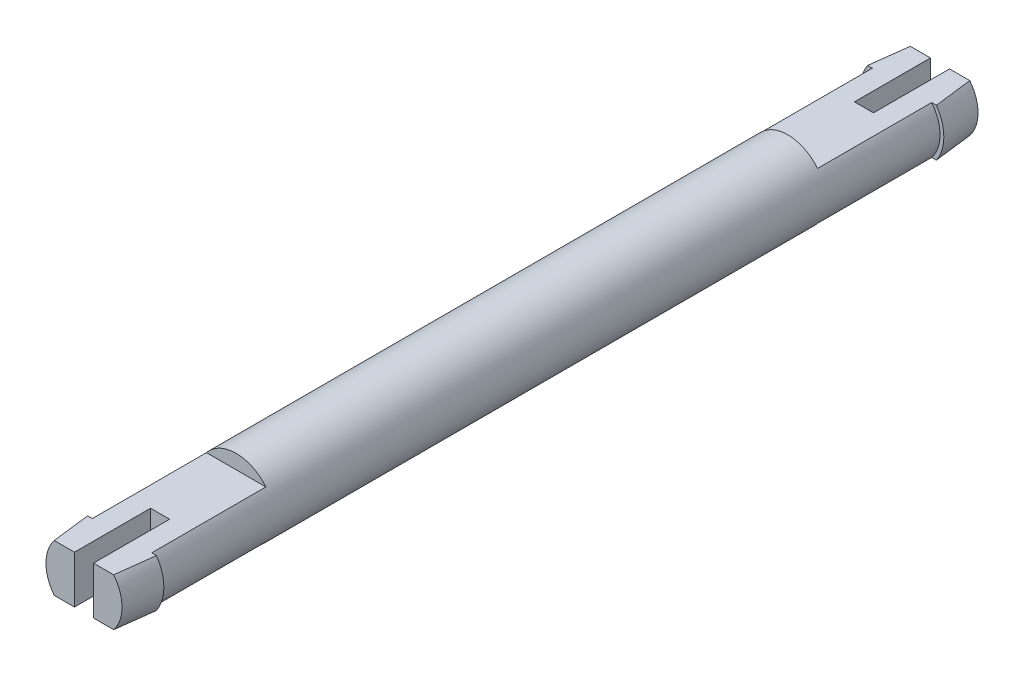
ISO-10303-21;
HEADER;
FILE_DESCRIPTION(('STEP AP214'),'2;1');
FILE_NAME('part.step','',(''),(''),'','','');
FILE_SCHEMA(('AUTOMOTIVE_DESIGN { 1 0 10303 214 1 1 1 1 }'));
ENDSEC;
DATA;
#1=APPLICATION_CONTEXT('core data for automotive mechanical design processes');
#2=APPLICATION_PROTOCOL_DEFINITION('international standard','automotive_design',2000,#1);
#3=PRODUCT_CONTEXT('',#1,'mechanical');
#4=PRODUCT('Part','Part','',(#3));
#5=PRODUCT_RELATED_PRODUCT_CATEGORY('part','',(#4));
#6=PRODUCT_DEFINITION_FORMATION('','',#4);
#7=PRODUCT_DEFINITION_CONTEXT('part definition',#1,'design');
#8=PRODUCT_DEFINITION('design','',#6,#7);
#9=PRODUCT_DEFINITION_SHAPE('','',#8);
#10=(LENGTH_UNIT() NAMED_UNIT(*) SI_UNIT(.MILLI.,.METRE.));
#11=(NAMED_UNIT(*) PLANE_ANGLE_UNIT() SI_UNIT($,.RADIAN.));
#12=(NAMED_UNIT(*) SI_UNIT($,.STERADIAN.) SOLID_ANGLE_UNIT());
#13=UNCERTAINTY_MEASURE_WITH_UNIT(LENGTH_MEASURE(1.E-05),#10,'distance_accuracy_value','');
#14=(GEOMETRIC_REPRESENTATION_CONTEXT(3) GLOBAL_UNCERTAINTY_ASSIGNED_CONTEXT((#13)) GLOBAL_UNIT_ASSIGNED_CONTEXT((#10,
#11,#12)) REPRESENTATION_CONTEXT('',''));
#15=CARTESIAN_POINT('',(0.,0.,0.));
#16=DIRECTION('',(0.,0.,1.));
#17=DIRECTION('',(1.,0.,0.));
#18=AXIS2_PLACEMENT_3D('',#15,#16,#17);
#19=CARTESIAN_POINT('',(0.,0.,-45.));
#20=DIRECTION('',(0.,0.,1.));
#21=DIRECTION('',(1.,0.,0.));
#22=AXIS2_PLACEMENT_3D('',#19,#20,#21);
#23=PLANE('',#22);
#24=DIRECTION('',(-1.,0.,0.));
#25=VECTOR('',#24,1.);
#26=CARTESIAN_POINT('',(0.,-1.25,-45.));
#27=LINE('',#26,#25);
#28=CARTESIAN_POINT('',(1.5612494995996,-1.25,-45.));
#29=VERTEX_POINT('',#28);
#30=CARTESIAN_POINT('',(0.499999999999999,-1.25,-45.));
#31=VERTEX_POINT('',#30);
#32=EDGE_CURVE('E213',#29,#31,#27,.T.);
#33=ORIENTED_EDGE('',*,*,#32,.T.);
#34=DIRECTION('',(0.,1.,0.));
#35=VECTOR('',#34,1.);
#36=CARTESIAN_POINT('',(0.499999999999999,-2.,-45.));
#37=LINE('',#36,#35);
#38=CARTESIAN_POINT('',(0.499999999999999,1.25,-45.));
#39=VERTEX_POINT('',#38);
#40=EDGE_CURVE('E199',#31,#39,#37,.T.);
#41=ORIENTED_EDGE('',*,*,#40,.T.);
#42=DIRECTION('',(1.,0.,0.));
#43=VECTOR('',#42,1.);
#44=CARTESIAN_POINT('',(0.,1.25,-45.));
#45=LINE('',#44,#43);
#46=CARTESIAN_POINT('',(1.5612494995996,1.25,-45.));
#47=VERTEX_POINT('',#46);
#48=EDGE_CURVE('E211',#39,#47,#45,.T.);
#49=ORIENTED_EDGE('',*,*,#48,.T.);
#50=CARTESIAN_POINT('',(0.,0.,-45.));
#51=DIRECTION('',(0.,0.,1.));
#52=DIRECTION('',(1.,0.,0.));
#53=AXIS2_PLACEMENT_3D('',#50,#51,#52);
#54=CIRCLE('',#53,2.);
#55=EDGE_CURVE('E408',#29,#47,#54,.T.);
#56=ORIENTED_EDGE('',*,*,#55,.F.);
#57=EDGE_LOOP('',(#33,#41,#49,#56));
#58=FACE_BOUND('',#57,.T.);
#59=ADVANCED_FACE('F34',(#58),#23,.F.);
#60=CARTESIAN_POINT('',(0.,0.,-43.));
#61=DIRECTION('',(0.,0.,1.));
#62=DIRECTION('',(1.,0.,0.));
#63=AXIS2_PLACEMENT_3D('',#60,#61,#62);
#64=PLANE('',#63);
#65=DIRECTION('',(-1.,0.,0.));
#66=VECTOR('',#65,1.);
#67=CARTESIAN_POINT('',(0.,-1.25,-43.));
#68=LINE('',#67,#66);
#69=CARTESIAN_POINT('',(1.81038669902327,-1.25,-43.0000000000001));
#70=VERTEX_POINT('',#69);
#71=CARTESIAN_POINT('',(1.5612494995996,-1.25,-43.));
#72=VERTEX_POINT('',#71);
#73=EDGE_CURVE('E260',#70,#72,#68,.T.);
#74=ORIENTED_EDGE('',*,*,#73,.F.);
#75=CARTESIAN_POINT('',(0.,0.,-43.));
#76=DIRECTION('',(0.,0.,1.));
#77=DIRECTION('',(1.,0.,0.));
#78=AXIS2_PLACEMENT_3D('',#75,#76,#77);
#79=CIRCLE('',#78,2.2);
#80=CARTESIAN_POINT('',(1.81038669902327,1.25,-43.0000000000001));
#81=VERTEX_POINT('',#80);
#82=EDGE_CURVE('E307',#70,#81,#79,.T.);
#83=ORIENTED_EDGE('',*,*,#82,.T.);
#84=DIRECTION('',(1.,0.,0.));
#85=VECTOR('',#84,1.);
#86=CARTESIAN_POINT('',(0.,1.25,-43.));
#87=LINE('',#86,#85);
#88=CARTESIAN_POINT('',(1.5612494995996,1.25,-43.));
#89=VERTEX_POINT('',#88);
#90=EDGE_CURVE('E291',#89,#81,#87,.T.);
#91=ORIENTED_EDGE('',*,*,#90,.F.);
#92=CARTESIAN_POINT('',(0.,0.,-43.));
#93=DIRECTION('',(0.,0.,1.));
#94=DIRECTION('',(1.,0.,0.));
#95=AXIS2_PLACEMENT_3D('',#92,#93,#94);
#96=CIRCLE('',#95,2.);
#97=EDGE_CURVE('E223',#89,#72,#96,.F.);
#98=ORIENTED_EDGE('',*,*,#97,.T.);
#99=EDGE_LOOP('',(#74,#83,#91,#98));
#100=FACE_BOUND('',#99,.T.);
#101=ADVANCED_FACE('F449',(#100),#64,.T.);
#102=CARTESIAN_POINT('',(0.,0.,-43.));
#103=DIRECTION('',(0.,0.,1.));
#104=DIRECTION('',(1.,0.,0.));
#105=AXIS2_PLACEMENT_3D('',#102,#103,#104);
#106=CONICAL_SURFACE('',#105,2.2,0.0996686524911603);
#107=CARTESIAN_POINT('',(-2.07154781563105,-1.25,-40.8053511030935));
#108=CARTESIAN_POINT('',(-2.03550722726414,-1.25,-41.1139180179247));
#109=CARTESIAN_POINT('',(-1.99922295149763,-1.25,-41.4224563190549));
#110=CARTESIAN_POINT('',(-1.92607039278533,-1.25,-42.0394648246496));
#111=CARTESIAN_POINT('',(-1.88920210764816,-1.25,-42.3479350288541));
#112=CARTESIAN_POINT('',(-1.77758091435319,-1.25,-43.2731887554345));
#113=CARTESIAN_POINT('',(-1.70180760472733,-1.25,-43.889850372761));
#114=CARTESIAN_POINT('',(-1.58512147260778,-1.25,-44.8144760218349));
#115=CARTESIAN_POINT('',(-1.54572075887383,-1.25,-45.1226307817609));
#116=CARTESIAN_POINT('',(-1.46564062998624,-1.25,-45.73877265943));
#117=CARTESIAN_POINT('',(-1.42496122188892,-1.25,-46.0467597780885));
#118=CARTESIAN_POINT('',(-1.34198072748192,-1.25,-46.6625339402322));
#119=CARTESIAN_POINT('',(-1.29967955336675,-1.25,-46.9703209719642));
#120=CARTESIAN_POINT('',(-1.21285635248196,-1.25,-47.5855868834585));
#121=CARTESIAN_POINT('',(-1.16833428338409,-1.25,-47.8930657572336));
#122=CARTESIAN_POINT('',(-1.12240193199714,-1.25,-48.2003390005902));
#123=B_SPLINE_CURVE_WITH_KNOTS('',3,(#107,#108,#109,#110,#111,#112,#113,#114,#115,#116,#117,
#118,#119,#120,#121,#122),.UNSPECIFIED.,.F.,.F.,(4,2,2,2,2,2,2,4),(0.,0.931993165762316,
1.86398982945296,3.7278775087708,4.65986577266912,5.59184889439995,6.52388254692387,
7.45593396996273),.UNSPECIFIED.);
#124=CARTESIAN_POINT('',(-1.81038669902326,-1.25,-43.0000000000001));
#125=VERTEX_POINT('',#124);
#126=CARTESIAN_POINT('',(-1.5612494995996,-1.25,-45.));
#127=VERTEX_POINT('',#126);
#128=EDGE_CURVE('E275',#125,#127,#123,.T.);
#129=ORIENTED_EDGE('',*,*,#128,.F.);
#130=CARTESIAN_POINT('',(-1.81038669902326,1.25,-43.0000000000001));
#131=VERTEX_POINT('',#130);
#132=EDGE_CURVE('E308',#131,#125,#79,.T.);
#133=ORIENTED_EDGE('',*,*,#132,.F.);
#134=CARTESIAN_POINT('',(-1.12240193199714,1.25,-48.2003390005902));
#135=CARTESIAN_POINT('',(-1.16007318188192,1.25,-47.948455021263));
#136=CARTESIAN_POINT('',(-1.19677568222069,1.25,-47.6964288561933));
#137=CARTESIAN_POINT('',(-1.26860770564258,1.25,-47.1921552657799));
#138=CARTESIAN_POINT('',(-1.30373724824443,1.25,-46.9399078432213));
#139=CARTESIAN_POINT('',(-1.37278762127905,1.25,-46.4352571718187));
#140=CARTESIAN_POINT('',(-1.40670849276505,1.25,-46.1828539285641));
#141=CARTESIAN_POINT('',(-1.47357063225507,1.25,-45.6779171395039));
#142=CARTESIAN_POINT('',(-1.50651189747342,1.25,-45.4253835933298));
#143=CARTESIAN_POINT('',(-1.56766910496902,1.25,-44.9506559350624));
#144=CARTESIAN_POINT('',(-1.59597605442951,1.25,-44.7284735200067));
#145=CARTESIAN_POINT('',(-1.66291250795864,1.25,-44.198043320873));
#146=CARTESIAN_POINT('',(-1.70129728585269,1.25,-43.8897646573885));
#147=CARTESIAN_POINT('',(-1.77723656698477,1.25,-43.2731045277543));
#148=CARTESIAN_POINT('',(-1.81479106820383,1.25,-42.9647230613564));
#149=CARTESIAN_POINT('',(-1.88921121609686,1.25,-42.3478817112025));
#150=CARTESIAN_POINT('',(-1.92607687286844,1.25,-42.0394218286632));
#151=CARTESIAN_POINT('',(-1.99922418459548,1.25,-41.4224342581659));
#152=CARTESIAN_POINT('',(-2.03550584228449,1.25,-41.1139065705321));
#153=CARTESIAN_POINT('',(-2.07154781563105,1.25,-40.8053511030935));
#154=B_SPLINE_CURVE_WITH_KNOTS('',3,(#134,#135,#136,#137,#138,#139,#140,#141,#142,#143,#144,
#145,#146,#147,#148,#149,#150,#151,#152,#153),.UNSPECIFIED.,.F.,.F.,(4,2,2,2,2,2,2,2,2,4),(0.,
0.764050536151589,1.52809158862138,2.29210666519177,3.0561239141567,3.72805834866276,
4.66003438385203,5.59201268506309,6.5239773138689,7.45593757911203),.UNSPECIFIED.);
#155=CARTESIAN_POINT('',(-1.5612494995996,1.25,-45.));
#156=VERTEX_POINT('',#155);
#157=EDGE_CURVE('E298',#156,#131,#154,.T.);
#158=ORIENTED_EDGE('',*,*,#157,.F.);
#159=EDGE_CURVE('E409',#156,#127,#54,.T.);
#160=ORIENTED_EDGE('',*,*,#159,.T.);
#161=EDGE_LOOP('',(#129,#133,#158,#160));
#162=FACE_BOUND('',#161,.T.);
#163=ADVANCED_FACE('F455',(#162),#106,.T.);
#164=CARTESIAN_POINT('',(0.,0.,0.));
#165=DIRECTION('',(0.,0.,1.));
#166=DIRECTION('',(1.,0.,0.));
#167=AXIS2_PLACEMENT_3D('',#164,#165,#166);
#168=PLANE('',#167);
#169=DIRECTION('',(0.,-1.,0.));
#170=VECTOR('',#169,1.);
#171=CARTESIAN_POINT('',(-0.5,2.001,0.));
#172=LINE('',#171,#170);
#173=CARTESIAN_POINT('',(-0.5,1.25,0.));
#174=VERTEX_POINT('',#173);
#175=CARTESIAN_POINT('',(-0.5,-1.25,0.));
#176=VERTEX_POINT('',#175);
#177=EDGE_CURVE('E324',#174,#176,#172,.T.);
#178=ORIENTED_EDGE('',*,*,#177,.F.);
#179=DIRECTION('',(1.,0.,0.));
#180=VECTOR('',#179,1.);
#181=CARTESIAN_POINT('',(0.,1.25,0.));
#182=LINE('',#181,#180);
#183=CARTESIAN_POINT('',(-1.5612494995996,1.25,0.));
#184=VERTEX_POINT('',#183);
#185=EDGE_CURVE('E423',#184,#174,#182,.T.);
#186=ORIENTED_EDGE('',*,*,#185,.F.);
#187=CARTESIAN_POINT('',(0.,0.,0.));
#188=DIRECTION('',(0.,0.,1.));
#189=DIRECTION('',(1.,0.,0.));
#190=AXIS2_PLACEMENT_3D('',#187,#188,#189);
#191=CIRCLE('',#190,2.);
#192=CARTESIAN_POINT('',(-1.5612494995996,-1.25,0.));
#193=VERTEX_POINT('',#192);
#194=EDGE_CURVE('E404',#184,#193,#191,.T.);
#195=ORIENTED_EDGE('',*,*,#194,.T.);
#196=DIRECTION('',(-1.,0.,0.));
#197=VECTOR('',#196,1.);
#198=CARTESIAN_POINT('',(0.,-1.25,0.));
#199=LINE('',#198,#197);
#200=EDGE_CURVE('E416',#176,#193,#199,.T.);
#201=ORIENTED_EDGE('',*,*,#200,.F.);
#202=EDGE_LOOP('',(#178,#186,#195,#201));
#203=FACE_BOUND('',#202,.T.);
#204=ADVANCED_FACE('F479',(#203),#168,.T.);
#205=CARTESIAN_POINT('',(0.,0.,0.));
#206=DIRECTION('',(0.,0.,-1.));
#207=DIRECTION('',(-1.,0.,0.));
#208=AXIS2_PLACEMENT_3D('',#205,#206,#207);
#209=CONICAL_SURFACE('',#208,2.,0.0996686524911626);
#210=CARTESIAN_POINT('',(-2.20629085167544,1.25,-5.35787712366069));
#211=CARTESIAN_POINT('',(-2.16911364127436,1.25,-5.03442418142204));
#212=CARTESIAN_POINT('',(-2.13171451989949,1.25,-4.71099685663597));
#213=CARTESIAN_POINT('',(-2.05638780976397,1.25,-4.06420290953939));
#214=CARTESIAN_POINT('',(-2.01846021960565,1.25,-3.74083628739172));
#215=CARTESIAN_POINT('',(-1.90376109024389,1.25,-2.77086975377677));
#216=CARTESIAN_POINT('',(-1.82607027221003,1.25,-2.12437765306017));
#217=CARTESIAN_POINT('',(-1.70685435031514,1.25,-1.15495865945316));
#218=CARTESIAN_POINT('',(-1.6666684414073,1.25,-0.831867113806443));
#219=CARTESIAN_POINT('',(-1.58517894557185,1.25,-0.185825927060364));
#220=CARTESIAN_POINT('',(-1.54387536251855,1.25,0.13712371452695));
#221=CARTESIAN_POINT('',(-1.45986916908057,1.25,0.78285426601202));
#222=CARTESIAN_POINT('',(-1.41716650618307,1.25,1.10563516911335));
#223=CARTESIAN_POINT('',(-1.32989270639121,1.25,1.75094775860942));
#224=CARTESIAN_POINT('',(-1.28532154707355,1.25,2.07347944196602));
#225=CARTESIAN_POINT('',(-1.2395811837065,1.25,2.39584846975232));
#226=B_SPLINE_CURVE_WITH_KNOTS('',3,(#210,#211,#212,#213,#214,#215,#216,#217,#218,#219,#220,
#221,#222,#223,#224,#225),.UNSPECIFIED.,.F.,.F.,(4,2,2,2,2,2,2,4),(0.,0.976747065340103,
1.95349671443936,3.90691894725973,4.88366075798535,5.86039918335276,6.83717431153944,
7.81396116508772),.UNSPECIFIED.);
#227=CARTESIAN_POINT('',(-1.81038669902317,1.25,-2.));
#228=VERTEX_POINT('',#227);
#229=EDGE_CURVE('E340',#228,#184,#226,.T.);
#230=ORIENTED_EDGE('',*,*,#229,.F.);
#231=CARTESIAN_POINT('',(0.,0.,-2.));
#232=DIRECTION('',(0.,0.,1.));
#233=DIRECTION('',(1.,0.,0.));
#234=AXIS2_PLACEMENT_3D('',#231,#232,#233);
#235=CIRCLE('',#234,2.2);
#236=CARTESIAN_POINT('',(-1.81038669902317,-1.25,-2.));
#237=VERTEX_POINT('',#236);
#238=EDGE_CURVE('E400',#228,#237,#235,.T.);
#239=ORIENTED_EDGE('',*,*,#238,.T.);
#240=CARTESIAN_POINT('',(-1.2395811837065,-1.25,2.39584846975232));
#241=CARTESIAN_POINT('',(-1.27708445163935,-1.25,2.13162650097859));
#242=CARTESIAN_POINT('',(-1.31378723609278,-1.25,1.8672925759978));
#243=CARTESIAN_POINT('',(-1.38587498011765,-1.25,1.33844690886302));
#244=CARTESIAN_POINT('',(-1.42125994975575,-1.25,1.07393516808307));
#245=CARTESIAN_POINT('',(-1.49099498681417,-1.25,0.544781873474842));
#246=CARTESIAN_POINT('',(-1.5253450774814,-1.25,0.280140322698457));
#247=CARTESIAN_POINT('',(-1.59319606726225,-1.25,-0.249251984131469));
#248=CARTESIAN_POINT('',(-1.62669696491898,-1.25,-0.514002740371573));
#249=CARTESIAN_POINT('',(-1.68902097967955,-1.25,-1.01186777884924));
#250=CARTESIAN_POINT('',(-1.71792365975446,-1.25,-1.24497212268679));
#251=CARTESIAN_POINT('',(-1.8260728146173,-1.25,-2.1243927650584));
#252=CARTESIAN_POINT('',(-1.90376491575885,-1.25,-2.77090043818358));
#253=CARTESIAN_POINT('',(-2.01846468029957,-1.25,-3.7408748394642));
#254=CARTESIAN_POINT('',(-2.05639139314501,-1.25,-4.06423386196728));
#255=CARTESIAN_POINT('',(-2.13171635303437,-1.25,-4.71101241305846));
#256=CARTESIAN_POINT('',(-2.16911460179215,-1.25,-5.03443194144689));
#257=CARTESIAN_POINT('',(-2.20629085167544,-1.25,-5.35787712366069));
#258=B_SPLINE_CURVE_WITH_KNOTS('',3,(#240,#241,#242,#243,#244,#245,#246,#247,#248,#249,#250,
#251,#252,#253,#254,#255,#256,#257),.UNSPECIFIED.,.F.,.F.,(4,2,2,2,2,2,2,2,4),(0.,
0.800607232202046,1.60120834737588,2.40179146488676,3.20237595579528,3.90704351295181,
5.86051217913121,6.83723890380333,7.81396246011893),.UNSPECIFIED.);
#259=EDGE_CURVE('E392',#193,#237,#258,.T.);
#260=ORIENTED_EDGE('',*,*,#259,.F.);
#261=ORIENTED_EDGE('',*,*,#194,.F.);
#262=EDGE_LOOP('',(#230,#239,#260,#261));
#263=FACE_BOUND('',#262,.T.);
#264=ADVANCED_FACE('F483',(#263),#209,.T.);
#265=CARTESIAN_POINT('',(0.,0.,-2.));
#266=DIRECTION('',(0.,0.,-1.));
#267=DIRECTION('',(-1.,0.,0.));
#268=AXIS2_PLACEMENT_3D('',#265,#266,#267);
#269=PLANE('',#268);
#270=DIRECTION('',(-1.,0.,0.));
#271=VECTOR('',#270,1.);
#272=CARTESIAN_POINT('',(0.,1.25,-2.));
#273=LINE('',#272,#271);
#274=CARTESIAN_POINT('',(1.81038669902317,1.25,-2.));
#275=VERTEX_POINT('',#274);
#276=CARTESIAN_POINT('',(1.5612494995996,1.25,-2.));
#277=VERTEX_POINT('',#276);
#278=EDGE_CURVE('E341',#275,#277,#273,.T.);
#279=ORIENTED_EDGE('',*,*,#278,.F.);
#280=CARTESIAN_POINT('',(1.81038669902317,-1.25,-2.));
#281=VERTEX_POINT('',#280);
#282=EDGE_CURVE('E401',#281,#275,#235,.T.);
#283=ORIENTED_EDGE('',*,*,#282,.F.);
#284=DIRECTION('',(1.,0.,0.));
#285=VECTOR('',#284,1.);
#286=CARTESIAN_POINT('',(0.,-1.25,-2.));
#287=LINE('',#286,#285);
#288=CARTESIAN_POINT('',(1.5612494995996,-1.25,-2.));
#289=VERTEX_POINT('',#288);
#290=EDGE_CURVE('E375',#289,#281,#287,.T.);
#291=ORIENTED_EDGE('',*,*,#290,.F.);
#292=CARTESIAN_POINT('',(0.,0.,-2.));
#293=DIRECTION('',(0.,0.,-1.));
#294=DIRECTION('',(-1.,0.,0.));
#295=AXIS2_PLACEMENT_3D('',#292,#293,#294);
#296=CIRCLE('',#295,2.);
#297=EDGE_CURVE('E413',#289,#277,#296,.F.);
#298=ORIENTED_EDGE('',*,*,#297,.T.);
#299=EDGE_LOOP('',(#279,#283,#291,#298));
#300=FACE_BOUND('',#299,.T.);
#301=ADVANCED_FACE('F488',(#300),#269,.T.);
#302=CARTESIAN_POINT('',(0.,0.,-45.));
#303=DIRECTION('',(0.,0.,1.));
#304=DIRECTION('',(1.,0.,0.));
#305=AXIS2_PLACEMENT_3D('',#302,#303,#304);
#306=CYLINDRICAL_SURFACE('',#305,2.);
#307=DIRECTION('',(0.,0.,1.));
#308=VECTOR('',#307,1.);
#309=CARTESIAN_POINT('',(-1.5612494995996,-1.25,-45.));
#310=LINE('',#309,#308);
#311=CARTESIAN_POINT('',(-1.5612494995996,-1.25,-37.));
#312=VERTEX_POINT('',#311);
#313=CARTESIAN_POINT('',(-1.5612494995996,-1.25,-43.));
#314=VERTEX_POINT('',#313);
#315=EDGE_CURVE('E282',#312,#314,#310,.F.);
#316=ORIENTED_EDGE('',*,*,#315,.F.);
#317=CARTESIAN_POINT('',(0.,0.,-37.));
#318=DIRECTION('',(0.,0.,-1.));
#319=DIRECTION('',(-1.,0.,0.));
#320=AXIS2_PLACEMENT_3D('',#317,#318,#319);
#321=CIRCLE('',#320,2.);
#322=CARTESIAN_POINT('',(1.5612494995996,-1.25,-37.));
#323=VERTEX_POINT('',#322);
#324=EDGE_CURVE('E234',#312,#323,#321,.F.);
#325=ORIENTED_EDGE('',*,*,#324,.T.);
#326=DIRECTION('',(0.,0.,1.));
#327=VECTOR('',#326,1.);
#328=CARTESIAN_POINT('',(1.5612494995996,-1.25,-45.));
#329=LINE('',#328,#327);
#330=EDGE_CURVE('E281',#72,#323,#329,.T.);
#331=ORIENTED_EDGE('',*,*,#330,.F.);
#332=ORIENTED_EDGE('',*,*,#97,.F.);
#333=DIRECTION('',(0.,0.,1.));
#334=VECTOR('',#333,1.);
#335=CARTESIAN_POINT('',(1.5612494995996,1.25,-45.));
#336=LINE('',#335,#334);
#337=CARTESIAN_POINT('',(1.5612494995996,1.25,-37.));
#338=VERTEX_POINT('',#337);
#339=EDGE_CURVE('E304',#338,#89,#336,.F.);
#340=ORIENTED_EDGE('',*,*,#339,.F.);
#341=CARTESIAN_POINT('',(0.,0.,-37.));
#342=DIRECTION('',(0.,0.,1.));
#343=DIRECTION('',(1.,0.,0.));
#344=AXIS2_PLACEMENT_3D('',#341,#342,#343);
#345=CIRCLE('',#344,2.);
#346=CARTESIAN_POINT('',(-1.5612494995996,1.25,-37.));
#347=VERTEX_POINT('',#346);
#348=EDGE_CURVE('E226',#347,#338,#345,.F.);
#349=ORIENTED_EDGE('',*,*,#348,.F.);
#350=DIRECTION('',(0.,0.,1.));
#351=VECTOR('',#350,1.);
#352=CARTESIAN_POINT('',(-1.5612494995996,1.25,-45.));
#353=LINE('',#352,#351);
#354=CARTESIAN_POINT('',(-1.5612494995996,1.25,-43.));
#355=VERTEX_POINT('',#354);
#356=EDGE_CURVE('E305',#355,#347,#353,.T.);
#357=ORIENTED_EDGE('',*,*,#356,.F.);
#358=EDGE_CURVE('E228',#314,#355,#96,.F.);
#359=ORIENTED_EDGE('',*,*,#358,.F.);
#360=EDGE_LOOP('',(#316,#325,#331,#332,#340,#349,#357,#359));
#361=FACE_BOUND('',#360,.T.);
#362=DIRECTION('',(0.,0.,1.));
#363=VECTOR('',#362,1.);
#364=CARTESIAN_POINT('',(1.5612494995996,1.25,-45.));
#365=LINE('',#364,#363);
#366=CARTESIAN_POINT('',(1.5612494995996,1.25,-8.));
#367=VERTEX_POINT('',#366);
#368=EDGE_CURVE('E370',#277,#367,#365,.F.);
#369=ORIENTED_EDGE('',*,*,#368,.F.);
#370=ORIENTED_EDGE('',*,*,#297,.F.);
#371=DIRECTION('',(0.,0.,1.));
#372=VECTOR('',#371,1.);
#373=CARTESIAN_POINT('',(1.5612494995996,-1.25,-45.));
#374=LINE('',#373,#372);
#375=CARTESIAN_POINT('',(1.5612494995996,-1.25,-8.));
#376=VERTEX_POINT('',#375);
#377=EDGE_CURVE('E383',#376,#289,#374,.T.);
#378=ORIENTED_EDGE('',*,*,#377,.F.);
#379=CARTESIAN_POINT('',(0.,0.,-8.));
#380=DIRECTION('',(0.,0.,-1.));
#381=DIRECTION('',(-1.,0.,0.));
#382=AXIS2_PLACEMENT_3D('',#379,#380,#381);
#383=CIRCLE('',#382,2.);
#384=CARTESIAN_POINT('',(-1.5612494995996,-1.25,-8.));
#385=VERTEX_POINT('',#384);
#386=EDGE_CURVE('E420',#385,#376,#383,.F.);
#387=ORIENTED_EDGE('',*,*,#386,.F.);
#388=DIRECTION('',(0.,0.,1.));
#389=VECTOR('',#388,1.);
#390=CARTESIAN_POINT('',(-1.5612494995996,-1.25,-45.));
#391=LINE('',#390,#389);
#392=CARTESIAN_POINT('',(-1.5612494995996,-1.25,-2.));
#393=VERTEX_POINT('',#392);
#394=EDGE_CURVE('E398',#393,#385,#391,.F.);
#395=ORIENTED_EDGE('',*,*,#394,.F.);
#396=CARTESIAN_POINT('',(-1.5612494995996,1.25,-2.));
#397=VERTEX_POINT('',#396);
#398=EDGE_CURVE('E412',#397,#393,#296,.F.);
#399=ORIENTED_EDGE('',*,*,#398,.F.);
#400=DIRECTION('',(0.,0.,1.));
#401=VECTOR('',#400,1.);
#402=CARTESIAN_POINT('',(-1.5612494995996,1.25,-45.));
#403=LINE('',#402,#401);
#404=CARTESIAN_POINT('',(-1.5612494995996,1.25,-8.));
#405=VERTEX_POINT('',#404);
#406=EDGE_CURVE('E348',#405,#397,#403,.T.);
#407=ORIENTED_EDGE('',*,*,#406,.F.);
#408=CARTESIAN_POINT('',(0.,0.,-8.));
#409=DIRECTION('',(0.,0.,-1.));
#410=DIRECTION('',(-1.,0.,0.));
#411=AXIS2_PLACEMENT_3D('',#408,#409,#410);
#412=CIRCLE('',#411,2.);
#413=EDGE_CURVE('E425',#367,#405,#412,.F.);
#414=ORIENTED_EDGE('',*,*,#413,.F.);
#415=EDGE_LOOP('',(#369,#370,#378,#387,#395,#399,#407,#414));
#416=FACE_BOUND('',#415,.T.);
#417=ADVANCED_FACE('F36',(#361,#416),#306,.T.);
#418=CARTESIAN_POINT('',(1.2395811837065,1.25,2.39584846975232));
#419=CARTESIAN_POINT('',(1.27708445163935,1.25,2.13162650097859));
#420=CARTESIAN_POINT('',(1.31378723609278,1.25,1.8672925759978));
#421=CARTESIAN_POINT('',(1.38587498011765,1.25,1.33844690886302));
#422=CARTESIAN_POINT('',(1.42125994975575,1.25,1.07393516808307));
#423=CARTESIAN_POINT('',(1.49099498681417,1.25,0.544781873474842));
#424=CARTESIAN_POINT('',(1.5253450774814,1.25,0.280140322698457));
#425=CARTESIAN_POINT('',(1.59319606726225,1.25,-0.249251984131469));
#426=CARTESIAN_POINT('',(1.62669696491898,1.25,-0.514002740371573));
#427=CARTESIAN_POINT('',(1.68902097967955,1.25,-1.01186777884924));
#428=CARTESIAN_POINT('',(1.71792365975446,1.25,-1.24497212268679));
#429=CARTESIAN_POINT('',(1.8260728146173,1.25,-2.1243927650584));
#430=CARTESIAN_POINT('',(1.90376491575885,1.25,-2.77090043818358));
#431=CARTESIAN_POINT('',(2.01846468029957,1.25,-3.7408748394642));
#432=CARTESIAN_POINT('',(2.05639139314501,1.25,-4.06423386196728));
#433=CARTESIAN_POINT('',(2.13171635303437,1.25,-4.71101241305846));
#434=CARTESIAN_POINT('',(2.16911460179215,1.25,-5.03443194144689));
#435=CARTESIAN_POINT('',(2.20629085167544,1.25,-5.35787712366069));
#436=B_SPLINE_CURVE_WITH_KNOTS('',3,(#418,#419,#420,#421,#422,#423,#424,#425,#426,#427,#428,
#429,#430,#431,#432,#433,#434,#435),.UNSPECIFIED.,.F.,.F.,(4,2,2,2,2,2,2,2,4),(0.,
0.800607232202046,1.60120834737588,2.40179146488676,3.20237595579528,3.90704351295181,
5.86051217913121,6.83723890380333,7.81396246011893),.UNSPECIFIED.);
#437=CARTESIAN_POINT('',(1.5612494995996,1.25,0.));
#438=VERTEX_POINT('',#437);
#439=EDGE_CURVE('E365',#438,#275,#436,.T.);
#440=ORIENTED_EDGE('',*,*,#439,.F.);
#441=CARTESIAN_POINT('',(1.5612494995996,-1.25,0.));
#442=VERTEX_POINT('',#441);
#443=EDGE_CURVE('E405',#442,#438,#191,.T.);
#444=ORIENTED_EDGE('',*,*,#443,.F.);
#445=CARTESIAN_POINT('',(2.20629085167544,-1.25,-5.35787712366069));
#446=CARTESIAN_POINT('',(2.16911364127436,-1.25,-5.03442418142204));
#447=CARTESIAN_POINT('',(2.13171451989949,-1.25,-4.71099685663597));
#448=CARTESIAN_POINT('',(2.05638780976397,-1.25,-4.06420290953939));
#449=CARTESIAN_POINT('',(2.01846021960565,-1.25,-3.74083628739172));
#450=CARTESIAN_POINT('',(1.90376109024389,-1.25,-2.77086975377677));
#451=CARTESIAN_POINT('',(1.82607027221003,-1.25,-2.12437765306017));
#452=CARTESIAN_POINT('',(1.70685435031514,-1.25,-1.15495865945316));
#453=CARTESIAN_POINT('',(1.6666684414073,-1.25,-0.831867113806443));
#454=CARTESIAN_POINT('',(1.58517894557185,-1.25,-0.185825927060364));
#455=CARTESIAN_POINT('',(1.54387536251855,-1.25,0.13712371452695));
#456=CARTESIAN_POINT('',(1.45986916908057,-1.25,0.78285426601202));
#457=CARTESIAN_POINT('',(1.41716650618307,-1.25,1.10563516911335));
#458=CARTESIAN_POINT('',(1.32989270639121,-1.25,1.75094775860942));
#459=CARTESIAN_POINT('',(1.28532154707355,-1.25,2.07347944196602));
#460=CARTESIAN_POINT('',(1.2395811837065,-1.25,2.39584846975232));
#461=B_SPLINE_CURVE_WITH_KNOTS('',3,(#445,#446,#447,#448,#449,#450,#451,#452,#453,#454,#455,
#456,#457,#458,#459,#460),.UNSPECIFIED.,.F.,.F.,(4,2,2,2,2,2,2,4),(0.,0.976747065340103,
1.95349671443936,3.90691894725973,4.88366075798535,5.86039918335276,6.83717431153944,
7.81396116508772),.UNSPECIFIED.);
#462=EDGE_CURVE('E377',#281,#442,#461,.T.);
#463=ORIENTED_EDGE('',*,*,#462,.F.);
#464=ORIENTED_EDGE('',*,*,#282,.T.);
#465=EDGE_LOOP('',(#440,#444,#463,#464));
#466=FACE_BOUND('',#465,.T.);
#467=ADVANCED_FACE('F350',(#466),#209,.T.);
#468=EDGE_CURVE('E338',#397,#228,#273,.T.);
#469=ORIENTED_EDGE('',*,*,#468,.F.);
#470=ORIENTED_EDGE('',*,*,#398,.T.);
#471=EDGE_CURVE('E378',#237,#393,#287,.T.);
#472=ORIENTED_EDGE('',*,*,#471,.F.);
#473=ORIENTED_EDGE('',*,*,#238,.F.);
#474=EDGE_LOOP('',(#469,#470,#472,#473));
#475=FACE_BOUND('',#474,.T.);
#476=ADVANCED_FACE('F390',(#475),#269,.T.);
#477=DIRECTION('',(0.,-1.,0.));
#478=VECTOR('',#477,1.);
#479=CARTESIAN_POINT('',(0.5,2.001,0.));
#480=LINE('',#479,#478);
#481=CARTESIAN_POINT('',(0.5,1.25,0.));
#482=VERTEX_POINT('',#481);
#483=CARTESIAN_POINT('',(0.5,-1.25,0.));
#484=VERTEX_POINT('',#483);
#485=EDGE_CURVE('E327',#482,#484,#480,.T.);
#486=ORIENTED_EDGE('',*,*,#485,.T.);
#487=EDGE_CURVE('E417',#442,#484,#199,.T.);
#488=ORIENTED_EDGE('',*,*,#487,.F.);
#489=ORIENTED_EDGE('',*,*,#443,.T.);
#490=EDGE_CURVE('E422',#482,#438,#182,.T.);
#491=ORIENTED_EDGE('',*,*,#490,.F.);
#492=EDGE_LOOP('',(#486,#488,#489,#491));
#493=FACE_BOUND('',#492,.T.);
#494=ADVANCED_FACE('F388',(#493),#168,.T.);
#495=CARTESIAN_POINT('',(-2.1,-1.25,-8.));
#496=DIRECTION('',(0.,1.,0.));
#497=DIRECTION('',(0.,0.,1.));
#498=AXIS2_PLACEMENT_3D('',#495,#496,#497);
#499=PLANE('',#498);
#500=DIRECTION('',(1.,0.,0.));
#501=VECTOR('',#500,1.);
#502=CARTESIAN_POINT('',(-0.5,-1.25,-4.));
#503=LINE('',#502,#501);
#504=CARTESIAN_POINT('',(-0.5,-1.25,-4.));
#505=VERTEX_POINT('',#504);
#506=CARTESIAN_POINT('',(0.5,-1.25,-4.));
#507=VERTEX_POINT('',#506);
#508=EDGE_CURVE('E318',#505,#507,#503,.T.);
#509=ORIENTED_EDGE('',*,*,#508,.F.);
#510=DIRECTION('',(0.,0.,-1.));
#511=VECTOR('',#510,1.);
#512=CARTESIAN_POINT('',(-0.5,-1.25,0.));
#513=LINE('',#512,#511);
#514=EDGE_CURVE('E315',#176,#505,#513,.T.);
#515=ORIENTED_EDGE('',*,*,#514,.F.);
#516=ORIENTED_EDGE('',*,*,#200,.T.);
#517=ORIENTED_EDGE('',*,*,#259,.T.);
#518=ORIENTED_EDGE('',*,*,#471,.T.);
#519=ORIENTED_EDGE('',*,*,#394,.T.);
#520=DIRECTION('',(-1.,0.,0.));
#521=VECTOR('',#520,1.);
#522=CARTESIAN_POINT('',(-2.1,-1.25,-8.));
#523=LINE('',#522,#521);
#524=EDGE_CURVE('E372',#376,#385,#523,.T.);
#525=ORIENTED_EDGE('',*,*,#524,.F.);
#526=ORIENTED_EDGE('',*,*,#377,.T.);
#527=ORIENTED_EDGE('',*,*,#290,.T.);
#528=ORIENTED_EDGE('',*,*,#462,.T.);
#529=ORIENTED_EDGE('',*,*,#487,.T.);
#530=DIRECTION('',(0.,0.,1.));
#531=VECTOR('',#530,1.);
#532=CARTESIAN_POINT('',(0.5,-1.25,0.));
#533=LINE('',#532,#531);
#534=EDGE_CURVE('E321',#507,#484,#533,.T.);
#535=ORIENTED_EDGE('',*,*,#534,.F.);
#536=EDGE_LOOP('',(#509,#515,#516,#517,#518,#519,#525,#526,#527,#528,#529,#535));
#537=FACE_BOUND('',#536,.T.);
#538=ADVANCED_FACE('F385',(#537),#499,.F.);
#539=CARTESIAN_POINT('',(-2.1,-1.25,-8.));
#540=DIRECTION('',(0.,0.,-1.));
#541=DIRECTION('',(-1.,0.,0.));
#542=AXIS2_PLACEMENT_3D('',#539,#540,#541);
#543=PLANE('',#542);
#544=ORIENTED_EDGE('',*,*,#386,.T.);
#545=ORIENTED_EDGE('',*,*,#524,.T.);
#546=EDGE_LOOP('',(#544,#545));
#547=FACE_BOUND('',#546,.T.);
#548=ADVANCED_FACE('F360',(#547),#543,.F.);
#549=CARTESIAN_POINT('',(-2.1,1.25,-8.));
#550=DIRECTION('',(0.,-1.,0.));
#551=DIRECTION('',(0.,0.,-1.));
#552=AXIS2_PLACEMENT_3D('',#549,#550,#551);
#553=PLANE('',#552);
#554=ORIENTED_EDGE('',*,*,#185,.T.);
#555=DIRECTION('',(0.,0.,1.));
#556=VECTOR('',#555,1.);
#557=CARTESIAN_POINT('',(-0.5,1.25,0.));
#558=LINE('',#557,#556);
#559=CARTESIAN_POINT('',(-0.5,1.25,-4.));
#560=VERTEX_POINT('',#559);
#561=EDGE_CURVE('E313',#560,#174,#558,.T.);
#562=ORIENTED_EDGE('',*,*,#561,.F.);
#563=DIRECTION('',(-1.,0.,0.));
#564=VECTOR('',#563,1.);
#565=CARTESIAN_POINT('',(-0.5,1.25,-4.));
#566=LINE('',#565,#564);
#567=CARTESIAN_POINT('',(0.5,1.25,-4.));
#568=VERTEX_POINT('',#567);
#569=EDGE_CURVE('E326',#568,#560,#566,.T.);
#570=ORIENTED_EDGE('',*,*,#569,.F.);
#571=DIRECTION('',(0.,0.,-1.));
#572=VECTOR('',#571,1.);
#573=CARTESIAN_POINT('',(0.5,1.25,0.));
#574=LINE('',#573,#572);
#575=EDGE_CURVE('E311',#482,#568,#574,.T.);
#576=ORIENTED_EDGE('',*,*,#575,.F.);
#577=ORIENTED_EDGE('',*,*,#490,.T.);
#578=ORIENTED_EDGE('',*,*,#439,.T.);
#579=ORIENTED_EDGE('',*,*,#278,.T.);
#580=ORIENTED_EDGE('',*,*,#368,.T.);
#581=DIRECTION('',(1.,0.,0.));
#582=VECTOR('',#581,1.);
#583=CARTESIAN_POINT('',(-2.1,1.25,-8.));
#584=LINE('',#583,#582);
#585=EDGE_CURVE('E335',#405,#367,#584,.T.);
#586=ORIENTED_EDGE('',*,*,#585,.F.);
#587=ORIENTED_EDGE('',*,*,#406,.T.);
#588=ORIENTED_EDGE('',*,*,#468,.T.);
#589=ORIENTED_EDGE('',*,*,#229,.T.);
#590=EDGE_LOOP('',(#554,#562,#570,#576,#577,#578,#579,#580,#586,#587,#588,#589));
#591=FACE_BOUND('',#590,.T.);
#592=ADVANCED_FACE('F354',(#591),#553,.F.);
#593=CARTESIAN_POINT('',(2.1,2.25,-8.));
#594=DIRECTION('',(0.,0.,-1.));
#595=DIRECTION('',(-1.,0.,0.));
#596=AXIS2_PLACEMENT_3D('',#593,#594,#595);
#597=PLANE('',#596);
#598=ORIENTED_EDGE('',*,*,#413,.T.);
#599=ORIENTED_EDGE('',*,*,#585,.T.);
#600=EDGE_LOOP('',(#598,#599));
#601=FACE_BOUND('',#600,.T.);
#602=ADVANCED_FACE('F359',(#601),#597,.F.);
#603=CARTESIAN_POINT('',(-0.5,2.001,0.));
#604=DIRECTION('',(-1.,0.,0.));
#605=DIRECTION('',(0.,0.,1.));
#606=AXIS2_PLACEMENT_3D('',#603,#604,#605);
#607=PLANE('',#606);
#608=ORIENTED_EDGE('',*,*,#561,.T.);
#609=ORIENTED_EDGE('',*,*,#177,.T.);
#610=ORIENTED_EDGE('',*,*,#514,.T.);
#611=DIRECTION('',(0.,-1.,0.));
#612=VECTOR('',#611,1.);
#613=CARTESIAN_POINT('',(-0.5,2.001,-4.));
#614=LINE('',#613,#612);
#615=EDGE_CURVE('E323',#560,#505,#614,.T.);
#616=ORIENTED_EDGE('',*,*,#615,.F.);
#617=EDGE_LOOP('',(#608,#609,#610,#616));
#618=FACE_BOUND('',#617,.T.);
#619=ADVANCED_FACE('F542',(#618),#607,.F.);
#620=CARTESIAN_POINT('',(0.5,2.001,0.));
#621=DIRECTION('',(1.,0.,0.));
#622=DIRECTION('',(0.,0.,-1.));
#623=AXIS2_PLACEMENT_3D('',#620,#621,#622);
#624=PLANE('',#623);
#625=ORIENTED_EDGE('',*,*,#575,.T.);
#626=DIRECTION('',(0.,-1.,0.));
#627=VECTOR('',#626,1.);
#628=CARTESIAN_POINT('',(0.5,2.001,-4.));
#629=LINE('',#628,#627);
#630=EDGE_CURVE('E330',#568,#507,#629,.T.);
#631=ORIENTED_EDGE('',*,*,#630,.T.);
#632=ORIENTED_EDGE('',*,*,#534,.T.);
#633=ORIENTED_EDGE('',*,*,#485,.F.);
#634=EDGE_LOOP('',(#625,#631,#632,#633));
#635=FACE_BOUND('',#634,.T.);
#636=ADVANCED_FACE('F547',(#635),#624,.F.);
#637=CARTESIAN_POINT('',(-0.5,2.001,-4.));
#638=DIRECTION('',(0.,0.,-1.));
#639=DIRECTION('',(-1.,0.,0.));
#640=AXIS2_PLACEMENT_3D('',#637,#638,#639);
#641=PLANE('',#640);
#642=ORIENTED_EDGE('',*,*,#569,.T.);
#643=ORIENTED_EDGE('',*,*,#615,.T.);
#644=ORIENTED_EDGE('',*,*,#508,.T.);
#645=ORIENTED_EDGE('',*,*,#630,.F.);
#646=EDGE_LOOP('',(#642,#643,#644,#645));
#647=FACE_BOUND('',#646,.T.);
#648=ADVANCED_FACE('F476',(#647),#641,.F.);
#649=EDGE_CURVE('E280',#314,#125,#68,.T.);
#650=ORIENTED_EDGE('',*,*,#649,.F.);
#651=ORIENTED_EDGE('',*,*,#358,.T.);
#652=EDGE_CURVE('E303',#131,#355,#87,.T.);
#653=ORIENTED_EDGE('',*,*,#652,.F.);
#654=ORIENTED_EDGE('',*,*,#132,.T.);
#655=EDGE_LOOP('',(#650,#651,#653,#654));
#656=FACE_BOUND('',#655,.T.);
#657=ADVANCED_FACE('F434',(#656),#64,.T.);
#658=CARTESIAN_POINT('',(1.12240193199715,-1.25,-48.2003390005902));
#659=CARTESIAN_POINT('',(1.16007318188192,-1.25,-47.9484550212629));
#660=CARTESIAN_POINT('',(1.19677568222069,-1.25,-47.6964288561933));
#661=CARTESIAN_POINT('',(1.26860770564258,-1.25,-47.1921552657798));
#662=CARTESIAN_POINT('',(1.30373724824444,-1.25,-46.9399078432212));
#663=CARTESIAN_POINT('',(1.37278762127905,-1.25,-46.4352571718187));
#664=CARTESIAN_POINT('',(1.40670849276505,-1.25,-46.1828539285641));
#665=CARTESIAN_POINT('',(1.47357063225507,-1.25,-45.6779171395039));
#666=CARTESIAN_POINT('',(1.50651189747343,-1.25,-45.4253835933298));
#667=CARTESIAN_POINT('',(1.56766910496902,-1.25,-44.9506559350624));
#668=CARTESIAN_POINT('',(1.59597605442952,-1.25,-44.7284735200067));
#669=CARTESIAN_POINT('',(1.66291250795864,-1.25,-44.198043320873));
#670=CARTESIAN_POINT('',(1.70129728585269,-1.25,-43.8897646573885));
#671=CARTESIAN_POINT('',(1.77723656698478,-1.25,-43.2731045277542));
#672=CARTESIAN_POINT('',(1.81479106820384,-1.25,-42.9647230613564));
#673=CARTESIAN_POINT('',(1.88921121609686,-1.25,-42.3478817112025));
#674=CARTESIAN_POINT('',(1.92607687286844,-1.25,-42.0394218286632));
#675=CARTESIAN_POINT('',(1.99922418459548,-1.25,-41.4224342581659));
#676=CARTESIAN_POINT('',(2.0355058422845,-1.25,-41.1139065705321));
#677=CARTESIAN_POINT('',(2.07154781563105,-1.25,-40.8053511030935));
#678=B_SPLINE_CURVE_WITH_KNOTS('',3,(#658,#659,#660,#661,#662,#663,#664,#665,#666,#667,#668,
#669,#670,#671,#672,#673,#674,#675,#676,#677),.UNSPECIFIED.,.F.,.F.,(4,2,2,2,2,2,2,2,2,4),(0.,
0.764050536151596,1.52809158862139,2.29210666519175,3.0561239141567,3.72805834866276,
4.66003438385204,5.59201268506311,6.52397731386891,7.45593757911203),.UNSPECIFIED.);
#679=EDGE_CURVE('E247',#29,#70,#678,.T.);
#680=ORIENTED_EDGE('',*,*,#679,.F.);
#681=ORIENTED_EDGE('',*,*,#55,.T.);
#682=CARTESIAN_POINT('',(2.07154781563105,1.25,-40.8053511030935));
#683=CARTESIAN_POINT('',(2.03550722726414,1.25,-41.1139180179247));
#684=CARTESIAN_POINT('',(1.99922295149764,1.25,-41.4224563190549));
#685=CARTESIAN_POINT('',(1.92607039278533,1.25,-42.0394648246496));
#686=CARTESIAN_POINT('',(1.88920210764817,1.25,-42.3479350288541));
#687=CARTESIAN_POINT('',(1.77758091435319,1.25,-43.2731887554345));
#688=CARTESIAN_POINT('',(1.70180760472733,1.25,-43.889850372761));
#689=CARTESIAN_POINT('',(1.58512147260778,1.25,-44.8144760218349));
#690=CARTESIAN_POINT('',(1.54572075887383,1.25,-45.1226307817609));
#691=CARTESIAN_POINT('',(1.46564062998624,1.25,-45.73877265943));
#692=CARTESIAN_POINT('',(1.42496122188892,1.25,-46.0467597780885));
#693=CARTESIAN_POINT('',(1.34198072748192,1.25,-46.6625339402322));
#694=CARTESIAN_POINT('',(1.29967955336675,1.25,-46.9703209719642));
#695=CARTESIAN_POINT('',(1.21285635248196,1.25,-47.5855868834585));
#696=CARTESIAN_POINT('',(1.16833428338409,1.25,-47.8930657572336));
#697=CARTESIAN_POINT('',(1.12240193199715,1.25,-48.2003390005902));
#698=B_SPLINE_CURVE_WITH_KNOTS('',3,(#682,#683,#684,#685,#686,#687,#688,#689,#690,#691,#692,
#693,#694,#695,#696,#697),.UNSPECIFIED.,.F.,.F.,(4,2,2,2,2,2,2,4),(0.,0.931993165762316,
1.86398982945296,3.7278775087708,4.65986577266912,5.59184889439995,6.52388254692387,
7.45593396996273),.UNSPECIFIED.);
#699=EDGE_CURVE('E221',#81,#47,#698,.T.);
#700=ORIENTED_EDGE('',*,*,#699,.F.);
#701=ORIENTED_EDGE('',*,*,#82,.F.);
#702=EDGE_LOOP('',(#680,#681,#700,#701));
#703=FACE_BOUND('',#702,.T.);
#704=ADVANCED_FACE('F262',(#703),#106,.T.);
#705=CARTESIAN_POINT('',(-0.500000000000002,1.25,-45.));
#706=VERTEX_POINT('',#705);
#707=EDGE_CURVE('E222',#156,#706,#45,.T.);
#708=ORIENTED_EDGE('',*,*,#707,.T.);
#709=DIRECTION('',(0.,1.,0.));
#710=VECTOR('',#709,1.);
#711=CARTESIAN_POINT('',(-0.500000000000002,-2.,-45.));
#712=LINE('',#711,#710);
#713=CARTESIAN_POINT('',(-0.500000000000002,-1.25,-45.));
#714=VERTEX_POINT('',#713);
#715=EDGE_CURVE('E214',#714,#706,#712,.T.);
#716=ORIENTED_EDGE('',*,*,#715,.F.);
#717=EDGE_CURVE('E57',#714,#127,#27,.T.);
#718=ORIENTED_EDGE('',*,*,#717,.T.);
#719=ORIENTED_EDGE('',*,*,#159,.F.);
#720=EDGE_LOOP('',(#708,#716,#718,#719));
#721=FACE_BOUND('',#720,.T.);
#722=ADVANCED_FACE('F295',(#721),#23,.F.);
#723=CARTESIAN_POINT('',(2.1,1.25,-37.));
#724=DIRECTION('',(0.,-1.,0.));
#725=DIRECTION('',(0.,0.,-1.));
#726=AXIS2_PLACEMENT_3D('',#723,#724,#725);
#727=PLANE('',#726);
#728=ORIENTED_EDGE('',*,*,#48,.F.);
#729=DIRECTION('',(0.,0.,-1.));
#730=VECTOR('',#729,1.);
#731=CARTESIAN_POINT('',(0.499999999999999,1.25,-41.));
#732=LINE('',#731,#730);
#733=CARTESIAN_POINT('',(0.499999999999999,1.25,-41.));
#734=VERTEX_POINT('',#733);
#735=EDGE_CURVE('E196',#734,#39,#732,.T.);
#736=ORIENTED_EDGE('',*,*,#735,.F.);
#737=DIRECTION('',(1.,0.,0.));
#738=VECTOR('',#737,1.);
#739=CARTESIAN_POINT('',(-0.500000000000001,1.25,-41.));
#740=LINE('',#739,#738);
#741=CARTESIAN_POINT('',(-0.500000000000001,1.25,-41.));
#742=VERTEX_POINT('',#741);
#743=EDGE_CURVE('E215',#742,#734,#740,.T.);
#744=ORIENTED_EDGE('',*,*,#743,.F.);
#745=DIRECTION('',(0.,0.,1.));
#746=VECTOR('',#745,1.);
#747=CARTESIAN_POINT('',(-0.500000000000001,1.25,-41.));
#748=LINE('',#747,#746);
#749=EDGE_CURVE('E206',#706,#742,#748,.T.);
#750=ORIENTED_EDGE('',*,*,#749,.F.);
#751=ORIENTED_EDGE('',*,*,#707,.F.);
#752=ORIENTED_EDGE('',*,*,#157,.T.);
#753=ORIENTED_EDGE('',*,*,#652,.T.);
#754=ORIENTED_EDGE('',*,*,#356,.T.);
#755=DIRECTION('',(-1.,0.,0.));
#756=VECTOR('',#755,1.);
#757=CARTESIAN_POINT('',(2.1,1.25,-37.));
#758=LINE('',#757,#756);
#759=EDGE_CURVE('E284',#338,#347,#758,.T.);
#760=ORIENTED_EDGE('',*,*,#759,.F.);
#761=ORIENTED_EDGE('',*,*,#339,.T.);
#762=ORIENTED_EDGE('',*,*,#90,.T.);
#763=ORIENTED_EDGE('',*,*,#699,.T.);
#764=EDGE_LOOP('',(#728,#736,#744,#750,#751,#752,#753,#754,#760,#761,#762,#763));
#765=FACE_BOUND('',#764,.T.);
#766=ADVANCED_FACE('F218',(#765),#727,.F.);
#767=CARTESIAN_POINT('',(2.1,2.25,-37.));
#768=DIRECTION('',(0.,0.,1.));
#769=DIRECTION('',(1.,0.,0.));
#770=AXIS2_PLACEMENT_3D('',#767,#768,#769);
#771=PLANE('',#770);
#772=ORIENTED_EDGE('',*,*,#348,.T.);
#773=ORIENTED_EDGE('',*,*,#759,.T.);
#774=EDGE_LOOP('',(#772,#773));
#775=FACE_BOUND('',#774,.T.);
#776=ADVANCED_FACE('F271',(#775),#771,.F.);
#777=CARTESIAN_POINT('',(2.1,-1.25,-37.));
#778=DIRECTION('',(0.,1.,0.));
#779=DIRECTION('',(0.,0.,1.));
#780=AXIS2_PLACEMENT_3D('',#777,#778,#779);
#781=PLANE('',#780);
#782=DIRECTION('',(1.,0.,0.));
#783=VECTOR('',#782,1.);
#784=CARTESIAN_POINT('',(2.1,-1.25,-41.));
#785=LINE('',#784,#783);
#786=CARTESIAN_POINT('',(-0.500000000000002,-1.25,-41.));
#787=VERTEX_POINT('',#786);
#788=CARTESIAN_POINT('',(0.499999999999999,-1.25,-41.));
#789=VERTEX_POINT('',#788);
#790=EDGE_CURVE('E42',#787,#789,#785,.T.);
#791=ORIENTED_EDGE('',*,*,#790,.T.);
#792=DIRECTION('',(0.,0.,-1.));
#793=VECTOR('',#792,1.);
#794=CARTESIAN_POINT('',(0.499999999999999,-1.25,-37.));
#795=LINE('',#794,#793);
#796=EDGE_CURVE('E11',#789,#31,#795,.T.);
#797=ORIENTED_EDGE('',*,*,#796,.T.);
#798=ORIENTED_EDGE('',*,*,#32,.F.);
#799=ORIENTED_EDGE('',*,*,#679,.T.);
#800=ORIENTED_EDGE('',*,*,#73,.T.);
#801=ORIENTED_EDGE('',*,*,#330,.T.);
#802=DIRECTION('',(1.,0.,0.));
#803=VECTOR('',#802,1.);
#804=CARTESIAN_POINT('',(2.1,-1.25,-37.));
#805=LINE('',#804,#803);
#806=EDGE_CURVE('E244',#312,#323,#805,.T.);
#807=ORIENTED_EDGE('',*,*,#806,.F.);
#808=ORIENTED_EDGE('',*,*,#315,.T.);
#809=ORIENTED_EDGE('',*,*,#649,.T.);
#810=ORIENTED_EDGE('',*,*,#128,.T.);
#811=ORIENTED_EDGE('',*,*,#717,.F.);
#812=DIRECTION('',(0.,0.,1.));
#813=VECTOR('',#812,1.);
#814=CARTESIAN_POINT('',(-0.5,-1.25,-37.));
#815=LINE('',#814,#813);
#816=EDGE_CURVE('E237',#714,#787,#815,.T.);
#817=ORIENTED_EDGE('',*,*,#816,.T.);
#818=EDGE_LOOP('',(#791,#797,#798,#799,#800,#801,#807,#808,#809,#810,#811,#817));
#819=FACE_BOUND('',#818,.T.);
#820=ADVANCED_FACE('F241',(#819),#781,.F.);
#821=CARTESIAN_POINT('',(2.1,-2.25,-37.));
#822=DIRECTION('',(0.,0.,-1.));
#823=DIRECTION('',(-1.,0.,0.));
#824=AXIS2_PLACEMENT_3D('',#821,#822,#823);
#825=PLANE('',#824);
#826=ORIENTED_EDGE('',*,*,#806,.T.);
#827=ORIENTED_EDGE('',*,*,#324,.F.);
#828=EDGE_LOOP('',(#826,#827));
#829=FACE_BOUND('',#828,.T.);
#830=ADVANCED_FACE('F270',(#829),#825,.T.);
#831=CARTESIAN_POINT('',(0.499999999999999,-2.,-41.));
#832=DIRECTION('',(1.,0.,0.));
#833=DIRECTION('',(0.,0.,-1.));
#834=AXIS2_PLACEMENT_3D('',#831,#832,#833);
#835=PLANE('',#834);
#836=DIRECTION('',(0.,1.,0.));
#837=VECTOR('',#836,1.);
#838=CARTESIAN_POINT('',(0.499999999999999,-2.,-41.));
#839=LINE('',#838,#837);
#840=EDGE_CURVE('E201',#789,#734,#839,.T.);
#841=ORIENTED_EDGE('',*,*,#840,.T.);
#842=ORIENTED_EDGE('',*,*,#735,.T.);
#843=ORIENTED_EDGE('',*,*,#40,.F.);
#844=ORIENTED_EDGE('',*,*,#796,.F.);
#845=EDGE_LOOP('',(#841,#842,#843,#844));
#846=FACE_BOUND('',#845,.T.);
#847=ADVANCED_FACE('F198',(#846),#835,.F.);
#848=CARTESIAN_POINT('',(-0.500000000000001,-2.,-41.));
#849=DIRECTION('',(0.,0.,1.));
#850=DIRECTION('',(1.,0.,0.));
#851=AXIS2_PLACEMENT_3D('',#848,#849,#850);
#852=PLANE('',#851);
#853=DIRECTION('',(0.,1.,0.));
#854=VECTOR('',#853,1.);
#855=CARTESIAN_POINT('',(-0.500000000000001,-2.,-41.));
#856=LINE('',#855,#854);
#857=EDGE_CURVE('E49',#787,#742,#856,.T.);
#858=ORIENTED_EDGE('',*,*,#857,.T.);
#859=ORIENTED_EDGE('',*,*,#743,.T.);
#860=ORIENTED_EDGE('',*,*,#840,.F.);
#861=ORIENTED_EDGE('',*,*,#790,.F.);
#862=EDGE_LOOP('',(#858,#859,#860,#861));
#863=FACE_BOUND('',#862,.T.);
#864=ADVANCED_FACE('F243',(#863),#852,.F.);
#865=CARTESIAN_POINT('',(-0.500000000000001,-2.,-41.));
#866=DIRECTION('',(-1.,0.,0.));
#867=DIRECTION('',(0.,0.,1.));
#868=AXIS2_PLACEMENT_3D('',#865,#866,#867);
#869=PLANE('',#868);
#870=ORIENTED_EDGE('',*,*,#715,.T.);
#871=ORIENTED_EDGE('',*,*,#749,.T.);
#872=ORIENTED_EDGE('',*,*,#857,.F.);
#873=ORIENTED_EDGE('',*,*,#816,.F.);
#874=EDGE_LOOP('',(#870,#871,#872,#873));
#875=FACE_BOUND('',#874,.T.);
#876=ADVANCED_FACE('F457',(#875),#869,.F.);
#877=CLOSED_SHELL('',(#59,#101,#163,#204,#264,#301,#417,#467,#476,#494,#538,#548,#592,#602,#619,
#636,#648,#657,#704,#722,#766,#776,#820,#830,#847,#864,#876));
#878=MANIFOLD_SOLID_BREP('B2',#877);
#879=ADVANCED_BREP_SHAPE_REPRESENTATION('',(#18,#878),#14);
#880=SHAPE_DEFINITION_REPRESENTATION(#9,#879);
ENDSEC;
END-ISO-10303-21;
